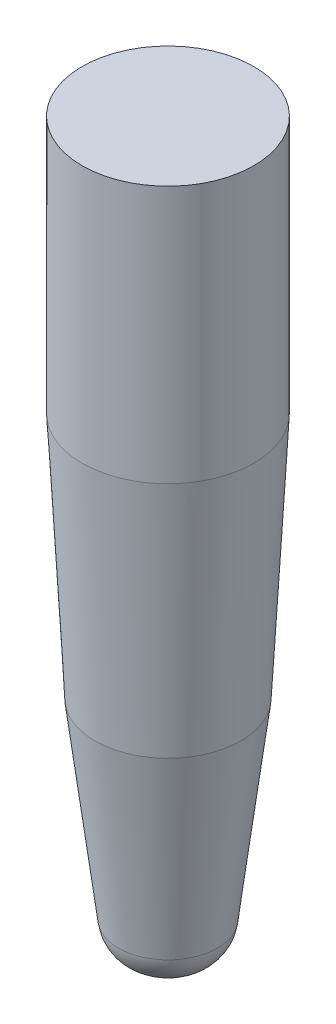
ISO-10303-21;
HEADER;
FILE_DESCRIPTION(('STEP AP214'),'2;1');
FILE_NAME('part.step','',(''),(''),'','','');
FILE_SCHEMA(('AUTOMOTIVE_DESIGN { 1 0 10303 214 1 1 1 1 }'));
ENDSEC;
DATA;
#1=APPLICATION_CONTEXT('core data for automotive mechanical design processes');
#2=APPLICATION_PROTOCOL_DEFINITION('international standard','automotive_design',2000,#1);
#3=PRODUCT_CONTEXT('',#1,'mechanical');
#4=PRODUCT('Part','Part','',(#3));
#5=PRODUCT_RELATED_PRODUCT_CATEGORY('part','',(#4));
#6=PRODUCT_DEFINITION_FORMATION('','',#4);
#7=PRODUCT_DEFINITION_CONTEXT('part definition',#1,'design');
#8=PRODUCT_DEFINITION('design','',#6,#7);
#9=PRODUCT_DEFINITION_SHAPE('','',#8);
#10=(LENGTH_UNIT() NAMED_UNIT(*) SI_UNIT(.MILLI.,.METRE.));
#11=(NAMED_UNIT(*) PLANE_ANGLE_UNIT() SI_UNIT($,.RADIAN.));
#12=(NAMED_UNIT(*) SI_UNIT($,.STERADIAN.) SOLID_ANGLE_UNIT());
#13=UNCERTAINTY_MEASURE_WITH_UNIT(LENGTH_MEASURE(1.E-05),#10,'distance_accuracy_value','');
#14=(GEOMETRIC_REPRESENTATION_CONTEXT(3) GLOBAL_UNCERTAINTY_ASSIGNED_CONTEXT((#13)) GLOBAL_UNIT_ASSIGNED_CONTEXT((#10,
#11,#12)) REPRESENTATION_CONTEXT('',''));
#15=CARTESIAN_POINT('',(0.,0.,0.));
#16=DIRECTION('',(0.,0.,1.));
#17=DIRECTION('',(1.,0.,0.));
#18=AXIS2_PLACEMENT_3D('',#15,#16,#17);
#19=CARTESIAN_POINT('',(0.,24.,0.));
#20=DIRECTION('',(0.,-1.,0.));
#21=DIRECTION('',(0.,0.,-1.));
#22=AXIS2_PLACEMENT_3D('',#19,#20,#21);
#23=CYLINDRICAL_SURFACE('',#22,8.);
#24=CARTESIAN_POINT('',(0.,24.,0.));
#25=DIRECTION('',(0.,1.,0.));
#26=DIRECTION('',(0.,0.,1.));
#27=AXIS2_PLACEMENT_3D('',#24,#25,#26);
#28=CIRCLE('',#27,8.);
#29=CARTESIAN_POINT('',(0.,24.,8.));
#30=VERTEX_POINT('',#29);
#31=EDGE_CURVE('E10',#30,#30,#28,.T.);
#32=ORIENTED_EDGE('',*,*,#31,.F.);
#33=EDGE_LOOP('',(#32));
#34=FACE_BOUND('',#33,.T.);
#35=CARTESIAN_POINT('',(0.,0.,0.));
#36=DIRECTION('',(0.,1.,0.));
#37=DIRECTION('',(0.,0.,1.));
#38=AXIS2_PLACEMENT_3D('',#35,#36,#37);
#39=CIRCLE('',#38,8.);
#40=CARTESIAN_POINT('',(0.,0.,8.));
#41=VERTEX_POINT('',#40);
#42=EDGE_CURVE('E41',#41,#41,#39,.T.);
#43=ORIENTED_EDGE('',*,*,#42,.T.);
#44=EDGE_LOOP('',(#43));
#45=FACE_BOUND('',#44,.T.);
#46=ADVANCED_FACE('F35',(#34,#45),#23,.T.);
#47=CARTESIAN_POINT('',(0.,24.,0.));
#48=DIRECTION('',(0.,1.,0.));
#49=DIRECTION('',(0.,0.,1.));
#50=AXIS2_PLACEMENT_3D('',#47,#48,#49);
#51=PLANE('',#50);
#52=ORIENTED_EDGE('',*,*,#31,.T.);
#53=EDGE_LOOP('',(#52));
#54=FACE_BOUND('',#53,.T.);
#55=ADVANCED_FACE('F79',(#54),#51,.T.);
#56=CARTESIAN_POINT('',(0.,0.,0.));
#57=DIRECTION('',(0.,1.,0.));
#58=DIRECTION('',(0.,0.,1.));
#59=AXIS2_PLACEMENT_3D('',#56,#57,#58);
#60=CONICAL_SURFACE('',#59,8.,0.05235987755983);
#61=CARTESIAN_POINT('',(0.,-23.,0.));
#62=DIRECTION('',(0.,1.,0.));
#63=DIRECTION('',(-1.,0.,0.));
#64=AXIS2_PLACEMENT_3D('',#61,#62,#63);
#65=CIRCLE('',#64,6.79462107649005);
#66=CARTESIAN_POINT('',(-6.79462107649005,-23.,0.));
#67=VERTEX_POINT('',#66);
#68=EDGE_CURVE('E54',#67,#67,#65,.T.);
#69=ORIENTED_EDGE('',*,*,#68,.T.);
#70=EDGE_LOOP('',(#69));
#71=FACE_BOUND('',#70,.T.);
#72=ORIENTED_EDGE('',*,*,#42,.F.);
#73=EDGE_LOOP('',(#72));
#74=FACE_BOUND('',#73,.T.);
#75=ADVANCED_FACE('F58',(#71,#74),#60,.T.);
#76=CARTESIAN_POINT('',(0.,-40.8078273618183,0.));
#77=DIRECTION('',(0.,1.,0.));
#78=DIRECTION('',(-1.,0.,0.));
#79=AXIS2_PLACEMENT_3D('',#76,#77,#78);
#80=CONICAL_SURFACE('',#79,4.60809481323439,0.122173047639607);
#81=ORIENTED_EDGE('',*,*,#68,.F.);
#82=EDGE_LOOP('',(#81));
#83=FACE_BOUND('',#82,.T.);
#84=CARTESIAN_POINT('',(0.,-40.8078273618183,0.));
#85=DIRECTION('',(0.,1.,0.));
#86=DIRECTION('',(-1.,0.,0.));
#87=AXIS2_PLACEMENT_3D('',#84,#85,#86);
#88=CIRCLE('',#87,4.60809481323439);
#89=CARTESIAN_POINT('',(-4.60809481323439,-40.8078273618183,0.));
#90=VERTEX_POINT('',#89);
#91=EDGE_CURVE('E45',#90,#90,#88,.T.);
#92=ORIENTED_EDGE('',*,*,#91,.T.);
#93=EDGE_LOOP('',(#92));
#94=FACE_BOUND('',#93,.T.);
#95=ADVANCED_FACE('F61',(#83,#94),#80,.T.);
#96=CARTESIAN_POINT('',(0.,-40.3648090244792,0.));
#97=DIRECTION('',(0.,1.,0.));
#98=DIRECTION('',(-1.,0.,0.));
#99=AXIS2_PLACEMENT_3D('',#96,#97,#98);
#100=DEGENERATE_TOROIDAL_SURFACE('',#99,1.,3.63519097552076,.T.);
#101=ORIENTED_EDGE('',*,*,#91,.F.);
#102=EDGE_LOOP('',(#101));
#103=FACE_BOUND('',#102,.T.);
#104=CARTESIAN_POINT('',(0.,-44.,0.));
#105=DIRECTION('',(0.,1.,0.));
#106=DIRECTION('',(-1.,0.,0.));
#107=AXIS2_PLACEMENT_3D('',#104,#105,#106);
#108=CIRCLE('',#107,1.);
#109=CARTESIAN_POINT('',(-0.999999999999997,-44.,0.));
#110=VERTEX_POINT('',#109);
#111=EDGE_CURVE('E49',#110,#110,#108,.T.);
#112=ORIENTED_EDGE('',*,*,#111,.T.);
#113=EDGE_LOOP('',(#112));
#114=FACE_BOUND('',#113,.T.);
#115=ADVANCED_FACE('F64',(#103,#114),#100,.T.);
#116=CARTESIAN_POINT('',(0.,-44.,0.));
#117=DIRECTION('',(0.,1.,0.));
#118=DIRECTION('',(-1.,0.,0.));
#119=AXIS2_PLACEMENT_3D('',#116,#117,#118);
#120=PLANE('',#119);
#121=ORIENTED_EDGE('',*,*,#111,.F.);
#122=EDGE_LOOP('',(#121));
#123=FACE_BOUND('',#122,.T.);
#124=ADVANCED_FACE('F70',(#123),#120,.F.);
#125=CLOSED_SHELL('',(#46,#55,#75,#95,#115,#124));
#126=MANIFOLD_SOLID_BREP('B2',#125);
#127=ADVANCED_BREP_SHAPE_REPRESENTATION('',(#18,#126),#14);
#128=SHAPE_DEFINITION_REPRESENTATION(#9,#127);
ENDSEC;
END-ISO-10303-21;
